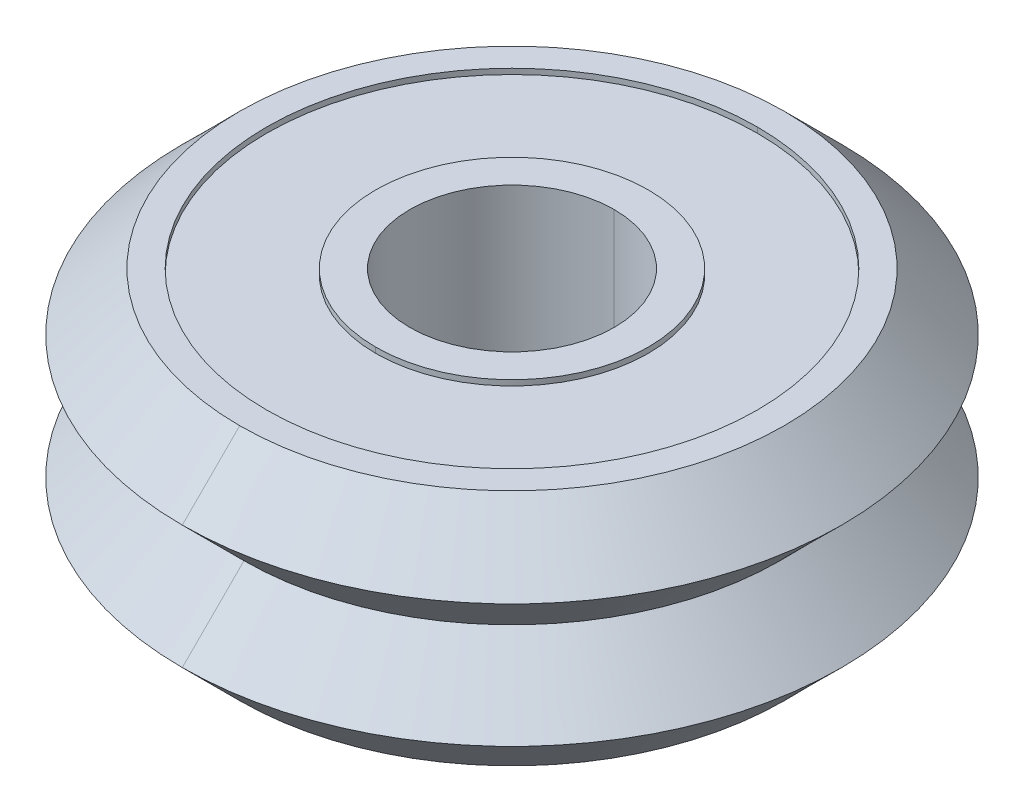
ISO-10303-21;
HEADER;
FILE_DESCRIPTION(('STEP AP214'),'2;1');
FILE_NAME('part.step','',(''),(''),'','','');
FILE_SCHEMA(('AUTOMOTIVE_DESIGN { 1 0 10303 214 1 1 1 1 }'));
ENDSEC;
DATA;
#1=APPLICATION_CONTEXT('core data for automotive mechanical design processes');
#2=APPLICATION_PROTOCOL_DEFINITION('international standard','automotive_design',2000,#1);
#3=PRODUCT_CONTEXT('',#1,'mechanical');
#4=PRODUCT('Part','Part','',(#3));
#5=PRODUCT_RELATED_PRODUCT_CATEGORY('part','',(#4));
#6=PRODUCT_DEFINITION_FORMATION('','',#4);
#7=PRODUCT_DEFINITION_CONTEXT('part definition',#1,'design');
#8=PRODUCT_DEFINITION('design','',#6,#7);
#9=PRODUCT_DEFINITION_SHAPE('','',#8);
#10=(LENGTH_UNIT() NAMED_UNIT(*) SI_UNIT(.MILLI.,.METRE.));
#11=(NAMED_UNIT(*) PLANE_ANGLE_UNIT() SI_UNIT($,.RADIAN.));
#12=(NAMED_UNIT(*) SI_UNIT($,.STERADIAN.) SOLID_ANGLE_UNIT());
#13=UNCERTAINTY_MEASURE_WITH_UNIT(LENGTH_MEASURE(1.E-05),#10,'distance_accuracy_value','');
#14=(GEOMETRIC_REPRESENTATION_CONTEXT(3) GLOBAL_UNCERTAINTY_ASSIGNED_CONTEXT((#13)) GLOBAL_UNIT_ASSIGNED_CONTEXT((#10,
#11,#12)) REPRESENTATION_CONTEXT('',''));
#15=CARTESIAN_POINT('',(0.,0.,0.));
#16=DIRECTION('',(0.,0.,1.));
#17=DIRECTION('',(1.,0.,0.));
#18=AXIS2_PLACEMENT_3D('',#15,#16,#17);
#19=CARTESIAN_POINT('',(0.,-5.296,0.));
#20=DIRECTION('',(0.,-1.,0.));
#21=DIRECTION('',(0.,0.,-1.));
#22=AXIS2_PLACEMENT_3D('',#19,#20,#21);
#23=CYLINDRICAL_SURFACE('',#22,6.35);
#24=DIRECTION('',(0.,-1.,0.));
#25=VECTOR('',#24,1.);
#26=CARTESIAN_POINT('',(0.,-5.296,6.35));
#27=LINE('',#26,#25);
#28=CARTESIAN_POINT('',(0.,-5.296,6.35));
#29=VERTEX_POINT('',#28);
#30=CARTESIAN_POINT('',(0.,-5.55,6.35));
#31=VERTEX_POINT('',#30);
#32=EDGE_CURVE('E176',#29,#31,#27,.T.);
#33=ORIENTED_EDGE('',*,*,#32,.F.);
#34=CARTESIAN_POINT('',(0.,-5.296,0.));
#35=DIRECTION('',(0.,1.,0.));
#36=DIRECTION('',(0.,0.,1.));
#37=AXIS2_PLACEMENT_3D('',#34,#35,#36);
#38=CIRCLE('',#37,6.35);
#39=CARTESIAN_POINT('',(0.,-5.296,-6.35));
#40=VERTEX_POINT('',#39);
#41=EDGE_CURVE('E11',#40,#29,#38,.T.);
#42=ORIENTED_EDGE('',*,*,#41,.F.);
#43=DIRECTION('',(0.,-1.,0.));
#44=VECTOR('',#43,1.);
#45=CARTESIAN_POINT('',(0.,-5.296,-6.35));
#46=LINE('',#45,#44);
#47=CARTESIAN_POINT('',(0.,-5.55,-6.35));
#48=VERTEX_POINT('',#47);
#49=EDGE_CURVE('E168',#40,#48,#46,.T.);
#50=ORIENTED_EDGE('',*,*,#49,.T.);
#51=CARTESIAN_POINT('',(0.,-5.55,0.));
#52=DIRECTION('',(0.,1.,0.));
#53=DIRECTION('',(0.,0.,1.));
#54=AXIS2_PLACEMENT_3D('',#51,#52,#53);
#55=CIRCLE('',#54,6.35);
#56=EDGE_CURVE('E155',#48,#31,#55,.T.);
#57=ORIENTED_EDGE('',*,*,#56,.T.);
#58=EDGE_LOOP('',(#33,#42,#50,#57));
#59=FACE_BOUND('',#58,.T.);
#60=ADVANCED_FACE('F16',(#59),#23,.T.);
#61=CARTESIAN_POINT('',(0.,-5.296,0.));
#62=DIRECTION('',(0.,-1.,0.));
#63=DIRECTION('',(0.,0.,-1.));
#64=AXIS2_PLACEMENT_3D('',#61,#62,#63);
#65=CYLINDRICAL_SURFACE('',#64,11.43);
#66=DIRECTION('',(0.,-1.,0.));
#67=VECTOR('',#66,1.);
#68=CARTESIAN_POINT('',(0.,-5.296,11.43));
#69=LINE('',#68,#67);
#70=CARTESIAN_POINT('',(0.,-5.296,11.43));
#71=VERTEX_POINT('',#70);
#72=CARTESIAN_POINT('',(0.,-5.55,11.43));
#73=VERTEX_POINT('',#72);
#74=EDGE_CURVE('E216',#71,#73,#69,.T.);
#75=ORIENTED_EDGE('',*,*,#74,.F.);
#76=CARTESIAN_POINT('',(0.,-5.296,0.));
#77=DIRECTION('',(0.,1.,0.));
#78=DIRECTION('',(0.,0.,1.));
#79=AXIS2_PLACEMENT_3D('',#76,#77,#78);
#80=CIRCLE('',#79,11.43);
#81=CARTESIAN_POINT('',(0.,-5.296,-11.43));
#82=VERTEX_POINT('',#81);
#83=EDGE_CURVE('E27',#71,#82,#80,.T.);
#84=ORIENTED_EDGE('',*,*,#83,.T.);
#85=DIRECTION('',(0.,-1.,0.));
#86=VECTOR('',#85,1.);
#87=CARTESIAN_POINT('',(0.,-5.296,-11.43));
#88=LINE('',#87,#86);
#89=CARTESIAN_POINT('',(0.,-5.55,-11.43));
#90=VERTEX_POINT('',#89);
#91=EDGE_CURVE('E224',#82,#90,#88,.T.);
#92=ORIENTED_EDGE('',*,*,#91,.T.);
#93=CARTESIAN_POINT('',(0.,-5.55,0.));
#94=DIRECTION('',(0.,1.,0.));
#95=DIRECTION('',(0.,0.,1.));
#96=AXIS2_PLACEMENT_3D('',#93,#94,#95);
#97=CIRCLE('',#96,11.43);
#98=EDGE_CURVE('E192',#73,#90,#97,.T.);
#99=ORIENTED_EDGE('',*,*,#98,.F.);
#100=EDGE_LOOP('',(#75,#84,#92,#99));
#101=FACE_BOUND('',#100,.T.);
#102=ADVANCED_FACE('F379',(#101),#65,.F.);
#103=CARTESIAN_POINT('',(0.,-5.296,0.));
#104=DIRECTION('',(0.,-1.,0.));
#105=DIRECTION('',(0.,0.,-1.));
#106=AXIS2_PLACEMENT_3D('',#103,#104,#105);
#107=PLANE('',#106);
#108=ORIENTED_EDGE('',*,*,#41,.T.);
#109=CARTESIAN_POINT('',(0.,-5.296,0.));
#110=DIRECTION('',(0.,1.,0.));
#111=DIRECTION('',(0.,0.,1.));
#112=AXIS2_PLACEMENT_3D('',#109,#110,#111);
#113=CIRCLE('',#112,6.35);
#114=EDGE_CURVE('E183',#29,#40,#113,.T.);
#115=ORIENTED_EDGE('',*,*,#114,.T.);
#116=EDGE_LOOP('',(#108,#115));
#117=FACE_BOUND('',#116,.T.);
#118=CARTESIAN_POINT('',(0.,-5.296,0.));
#119=DIRECTION('',(0.,1.,0.));
#120=DIRECTION('',(0.,0.,1.));
#121=AXIS2_PLACEMENT_3D('',#118,#119,#120);
#122=CIRCLE('',#121,11.43);
#123=EDGE_CURVE('E173',#82,#71,#122,.T.);
#124=ORIENTED_EDGE('',*,*,#123,.F.);
#125=ORIENTED_EDGE('',*,*,#83,.F.);
#126=EDGE_LOOP('',(#124,#125));
#127=FACE_BOUND('',#126,.T.);
#128=ADVANCED_FACE('F384',(#117,#127),#107,.T.);
#129=CARTESIAN_POINT('',(0.,5.296,0.));
#130=DIRECTION('',(0.,1.,0.));
#131=DIRECTION('',(0.,0.,1.));
#132=AXIS2_PLACEMENT_3D('',#129,#130,#131);
#133=CYLINDRICAL_SURFACE('',#132,6.35);
#134=DIRECTION('',(0.,1.,0.));
#135=VECTOR('',#134,1.);
#136=CARTESIAN_POINT('',(0.,5.296,-6.35));
#137=LINE('',#136,#135);
#138=CARTESIAN_POINT('',(0.,5.296,-6.35));
#139=VERTEX_POINT('',#138);
#140=CARTESIAN_POINT('',(0.,5.55,-6.35));
#141=VERTEX_POINT('',#140);
#142=EDGE_CURVE('E229',#139,#141,#137,.T.);
#143=ORIENTED_EDGE('',*,*,#142,.F.);
#144=CARTESIAN_POINT('',(0.,5.296,0.));
#145=DIRECTION('',(0.,1.,0.));
#146=DIRECTION('',(0.,0.,1.));
#147=AXIS2_PLACEMENT_3D('',#144,#145,#146);
#148=CIRCLE('',#147,6.35);
#149=CARTESIAN_POINT('',(0.,5.296,6.35));
#150=VERTEX_POINT('',#149);
#151=EDGE_CURVE('E206',#139,#150,#148,.T.);
#152=ORIENTED_EDGE('',*,*,#151,.T.);
#153=DIRECTION('',(0.,1.,0.));
#154=VECTOR('',#153,1.);
#155=CARTESIAN_POINT('',(0.,5.296,6.35));
#156=LINE('',#155,#154);
#157=CARTESIAN_POINT('',(0.,5.55,6.35));
#158=VERTEX_POINT('',#157);
#159=EDGE_CURVE('E187',#150,#158,#156,.T.);
#160=ORIENTED_EDGE('',*,*,#159,.T.);
#161=CARTESIAN_POINT('',(0.,5.55,0.));
#162=DIRECTION('',(0.,1.,0.));
#163=DIRECTION('',(0.,0.,1.));
#164=AXIS2_PLACEMENT_3D('',#161,#162,#163);
#165=CIRCLE('',#164,6.35);
#166=EDGE_CURVE('E196',#141,#158,#165,.T.);
#167=ORIENTED_EDGE('',*,*,#166,.F.);
#168=EDGE_LOOP('',(#143,#152,#160,#167));
#169=FACE_BOUND('',#168,.T.);
#170=ADVANCED_FACE('F467',(#169),#133,.T.);
#171=CARTESIAN_POINT('',(0.,5.296,0.));
#172=DIRECTION('',(0.,1.,0.));
#173=DIRECTION('',(1.,0.,0.));
#174=AXIS2_PLACEMENT_3D('',#171,#172,#173);
#175=PLANE('',#174);
#176=CARTESIAN_POINT('',(0.,5.296,0.));
#177=DIRECTION('',(0.,1.,0.));
#178=DIRECTION('',(0.,0.,1.));
#179=AXIS2_PLACEMENT_3D('',#176,#177,#178);
#180=CIRCLE('',#179,6.35);
#181=EDGE_CURVE('E225',#150,#139,#180,.T.);
#182=ORIENTED_EDGE('',*,*,#181,.F.);
#183=ORIENTED_EDGE('',*,*,#151,.F.);
#184=EDGE_LOOP('',(#182,#183));
#185=FACE_BOUND('',#184,.T.);
#186=CARTESIAN_POINT('',(0.,5.296,0.));
#187=DIRECTION('',(0.,1.,0.));
#188=DIRECTION('',(0.,0.,1.));
#189=AXIS2_PLACEMENT_3D('',#186,#187,#188);
#190=CIRCLE('',#189,11.43);
#191=CARTESIAN_POINT('',(0.,5.296,11.43));
#192=VERTEX_POINT('',#191);
#193=CARTESIAN_POINT('',(0.,5.296,-11.43));
#194=VERTEX_POINT('',#193);
#195=EDGE_CURVE('E203',#192,#194,#190,.T.);
#196=ORIENTED_EDGE('',*,*,#195,.T.);
#197=CARTESIAN_POINT('',(0.,5.296,0.));
#198=DIRECTION('',(0.,1.,0.));
#199=DIRECTION('',(0.,0.,1.));
#200=AXIS2_PLACEMENT_3D('',#197,#198,#199);
#201=CIRCLE('',#200,11.43);
#202=EDGE_CURVE('E269',#194,#192,#201,.T.);
#203=ORIENTED_EDGE('',*,*,#202,.T.);
#204=EDGE_LOOP('',(#196,#203));
#205=FACE_BOUND('',#204,.T.);
#206=ADVANCED_FACE('F18',(#185,#205),#175,.T.);
#207=CARTESIAN_POINT('',(0.,5.296,0.));
#208=DIRECTION('',(0.,1.,0.));
#209=DIRECTION('',(0.,0.,1.));
#210=AXIS2_PLACEMENT_3D('',#207,#208,#209);
#211=CYLINDRICAL_SURFACE('',#210,11.43);
#212=DIRECTION('',(0.,1.,0.));
#213=VECTOR('',#212,1.);
#214=CARTESIAN_POINT('',(0.,5.296,-11.43));
#215=LINE('',#214,#213);
#216=CARTESIAN_POINT('',(0.,5.55,-11.43));
#217=VERTEX_POINT('',#216);
#218=EDGE_CURVE('E261',#194,#217,#215,.T.);
#219=ORIENTED_EDGE('',*,*,#218,.F.);
#220=ORIENTED_EDGE('',*,*,#195,.F.);
#221=DIRECTION('',(0.,1.,0.));
#222=VECTOR('',#221,1.);
#223=CARTESIAN_POINT('',(0.,5.296,11.43));
#224=LINE('',#223,#222);
#225=CARTESIAN_POINT('',(0.,5.55,11.43));
#226=VERTEX_POINT('',#225);
#227=EDGE_CURVE('E246',#192,#226,#224,.T.);
#228=ORIENTED_EDGE('',*,*,#227,.T.);
#229=CARTESIAN_POINT('',(0.,5.55,0.));
#230=DIRECTION('',(0.,1.,0.));
#231=DIRECTION('',(0.,0.,1.));
#232=AXIS2_PLACEMENT_3D('',#229,#230,#231);
#233=CIRCLE('',#232,11.43);
#234=EDGE_CURVE('E210',#226,#217,#233,.T.);
#235=ORIENTED_EDGE('',*,*,#234,.T.);
#236=EDGE_LOOP('',(#219,#220,#228,#235));
#237=FACE_BOUND('',#236,.T.);
#238=ADVANCED_FACE('F556',(#237),#211,.F.);
#239=CARTESIAN_POINT('',(0.,2.875,0.));
#240=DIRECTION('',(0.,-1.,0.));
#241=DIRECTION('',(0.,0.,-1.));
#242=AXIS2_PLACEMENT_3D('',#239,#240,#241);
#243=CONICAL_SURFACE('',#242,15.365,0.785398163397449);
#244=DIRECTION('',(0.,-0.707106781186547,0.707106781186548));
#245=VECTOR('',#244,1.);
#246=CARTESIAN_POINT('',(0.,2.875,15.365));
#247=LINE('',#246,#245);
#248=CARTESIAN_POINT('',(0.,5.55,12.69));
#249=VERTEX_POINT('',#248);
#250=CARTESIAN_POINT('',(0.,2.875,15.365));
#251=VERTEX_POINT('',#250);
#252=EDGE_CURVE('E259',#249,#251,#247,.T.);
#253=ORIENTED_EDGE('',*,*,#252,.F.);
#254=CARTESIAN_POINT('',(0.,5.55,0.));
#255=DIRECTION('',(0.,1.,0.));
#256=DIRECTION('',(0.,0.,1.));
#257=AXIS2_PLACEMENT_3D('',#254,#255,#256);
#258=CIRCLE('',#257,12.69);
#259=CARTESIAN_POINT('',(0.,5.55,-12.69));
#260=VERTEX_POINT('',#259);
#261=EDGE_CURVE('E213',#260,#249,#258,.T.);
#262=ORIENTED_EDGE('',*,*,#261,.F.);
#263=DIRECTION('',(0.,-0.707106781186547,-0.707106781186548));
#264=VECTOR('',#263,1.);
#265=CARTESIAN_POINT('',(0.,2.875,-15.365));
#266=LINE('',#265,#264);
#267=CARTESIAN_POINT('',(0.,2.875,-15.365));
#268=VERTEX_POINT('',#267);
#269=EDGE_CURVE('E291',#260,#268,#266,.T.);
#270=ORIENTED_EDGE('',*,*,#269,.T.);
#271=CARTESIAN_POINT('',(0.,2.875,0.));
#272=DIRECTION('',(0.,1.,0.));
#273=DIRECTION('',(0.,0.,1.));
#274=AXIS2_PLACEMENT_3D('',#271,#272,#273);
#275=CIRCLE('',#274,15.365);
#276=EDGE_CURVE('E207',#268,#251,#275,.T.);
#277=ORIENTED_EDGE('',*,*,#276,.T.);
#278=EDGE_LOOP('',(#253,#262,#270,#277));
#279=FACE_BOUND('',#278,.T.);
#280=ADVANCED_FACE('F359',(#279),#243,.T.);
#281=CARTESIAN_POINT('',(0.,0.,0.));
#282=DIRECTION('',(0.,1.,0.));
#283=DIRECTION('',(0.,0.,1.));
#284=AXIS2_PLACEMENT_3D('',#281,#282,#283);
#285=CONICAL_SURFACE('',#284,12.49,0.785398163397448);
#286=DIRECTION('',(0.,0.707106781186548,-0.707106781186547));
#287=VECTOR('',#286,1.);
#288=CARTESIAN_POINT('',(0.,0.,-12.49));
#289=LINE('',#288,#287);
#290=CARTESIAN_POINT('',(0.,0.,-12.49));
#291=VERTEX_POINT('',#290);
#292=EDGE_CURVE('E290',#291,#268,#289,.T.);
#293=ORIENTED_EDGE('',*,*,#292,.F.);
#294=CARTESIAN_POINT('',(0.,0.,0.));
#295=DIRECTION('',(0.,1.,0.));
#296=DIRECTION('',(0.,0.,1.));
#297=AXIS2_PLACEMENT_3D('',#294,#295,#296);
#298=CIRCLE('',#297,12.49);
#299=CARTESIAN_POINT('',(0.,0.,12.49));
#300=VERTEX_POINT('',#299);
#301=EDGE_CURVE('E245',#291,#300,#298,.T.);
#302=ORIENTED_EDGE('',*,*,#301,.T.);
#303=DIRECTION('',(0.,0.707106781186548,0.707106781186547));
#304=VECTOR('',#303,1.);
#305=CARTESIAN_POINT('',(0.,0.,12.49));
#306=LINE('',#305,#304);
#307=EDGE_CURVE('E239',#300,#251,#306,.T.);
#308=ORIENTED_EDGE('',*,*,#307,.T.);
#309=ORIENTED_EDGE('',*,*,#276,.F.);
#310=EDGE_LOOP('',(#293,#302,#308,#309));
#311=FACE_BOUND('',#310,.T.);
#312=ADVANCED_FACE('F353',(#311),#285,.T.);
#313=CARTESIAN_POINT('',(0.,-2.875,0.));
#314=DIRECTION('',(0.,-1.,0.));
#315=DIRECTION('',(0.,0.,-1.));
#316=AXIS2_PLACEMENT_3D('',#313,#314,#315);
#317=CONICAL_SURFACE('',#316,15.365,0.785398163397448);
#318=DIRECTION('',(0.,-0.707106781186548,0.707106781186547));
#319=VECTOR('',#318,1.);
#320=CARTESIAN_POINT('',(0.,-2.875,15.365));
#321=LINE('',#320,#319);
#322=CARTESIAN_POINT('',(0.,-2.875,15.365));
#323=VERTEX_POINT('',#322);
#324=EDGE_CURVE('E235',#300,#323,#321,.T.);
#325=ORIENTED_EDGE('',*,*,#324,.F.);
#326=ORIENTED_EDGE('',*,*,#301,.F.);
#327=DIRECTION('',(0.,-0.707106781186548,-0.707106781186547));
#328=VECTOR('',#327,1.);
#329=CARTESIAN_POINT('',(0.,-2.875,-15.365));
#330=LINE('',#329,#328);
#331=CARTESIAN_POINT('',(0.,-2.875,-15.365));
#332=VERTEX_POINT('',#331);
#333=EDGE_CURVE('E202',#291,#332,#330,.T.);
#334=ORIENTED_EDGE('',*,*,#333,.T.);
#335=CARTESIAN_POINT('',(0.,-2.875,0.));
#336=DIRECTION('',(0.,1.,0.));
#337=DIRECTION('',(0.,0.,1.));
#338=AXIS2_PLACEMENT_3D('',#335,#336,#337);
#339=CIRCLE('',#338,15.365);
#340=EDGE_CURVE('E164',#332,#323,#339,.T.);
#341=ORIENTED_EDGE('',*,*,#340,.T.);
#342=EDGE_LOOP('',(#325,#326,#334,#341));
#343=FACE_BOUND('',#342,.T.);
#344=ADVANCED_FACE('F398',(#343),#317,.T.);
#345=CARTESIAN_POINT('',(0.,-5.55,0.));
#346=DIRECTION('',(0.,1.,0.));
#347=DIRECTION('',(0.,0.,1.));
#348=AXIS2_PLACEMENT_3D('',#345,#346,#347);
#349=CONICAL_SURFACE('',#348,12.69,0.785398163397449);
#350=DIRECTION('',(0.,0.707106781186547,-0.707106781186548));
#351=VECTOR('',#350,1.);
#352=CARTESIAN_POINT('',(0.,-5.55,-12.69));
#353=LINE('',#352,#351);
#354=CARTESIAN_POINT('',(0.,-5.55,-12.69));
#355=VERTEX_POINT('',#354);
#356=EDGE_CURVE('E201',#355,#332,#353,.T.);
#357=ORIENTED_EDGE('',*,*,#356,.F.);
#358=CARTESIAN_POINT('',(0.,-5.55,0.));
#359=DIRECTION('',(0.,1.,0.));
#360=DIRECTION('',(0.,0.,1.));
#361=AXIS2_PLACEMENT_3D('',#358,#359,#360);
#362=CIRCLE('',#361,12.69);
#363=CARTESIAN_POINT('',(0.,-5.55,12.69));
#364=VERTEX_POINT('',#363);
#365=EDGE_CURVE('E189',#355,#364,#362,.T.);
#366=ORIENTED_EDGE('',*,*,#365,.T.);
#367=DIRECTION('',(0.,0.707106781186547,0.707106781186548));
#368=VECTOR('',#367,1.);
#369=CARTESIAN_POINT('',(0.,-5.55,12.69));
#370=LINE('',#369,#368);
#371=EDGE_CURVE('E230',#364,#323,#370,.T.);
#372=ORIENTED_EDGE('',*,*,#371,.T.);
#373=ORIENTED_EDGE('',*,*,#340,.F.);
#374=EDGE_LOOP('',(#357,#366,#372,#373));
#375=FACE_BOUND('',#374,.T.);
#376=ADVANCED_FACE('F396',(#375),#349,.T.);
#377=CARTESIAN_POINT('',(12.69,-5.55,0.));
#378=DIRECTION('',(0.,1.,0.));
#379=DIRECTION('',(1.,0.,0.));
#380=AXIS2_PLACEMENT_3D('',#377,#378,#379);
#381=PLANE('',#380);
#382=CARTESIAN_POINT('',(0.,-5.55,0.));
#383=DIRECTION('',(0.,1.,0.));
#384=DIRECTION('',(0.,0.,1.));
#385=AXIS2_PLACEMENT_3D('',#382,#383,#384);
#386=CIRCLE('',#385,4.7625);
#387=CARTESIAN_POINT('',(0.,-5.55,4.7625));
#388=VERTEX_POINT('',#387);
#389=CARTESIAN_POINT('',(0.,-5.55,-4.7625));
#390=VERTEX_POINT('',#389);
#391=EDGE_CURVE('E165',#388,#390,#386,.T.);
#392=ORIENTED_EDGE('',*,*,#391,.T.);
#393=CARTESIAN_POINT('',(0.,-5.55,0.));
#394=DIRECTION('',(0.,1.,0.));
#395=DIRECTION('',(0.,0.,1.));
#396=AXIS2_PLACEMENT_3D('',#393,#394,#395);
#397=CIRCLE('',#396,4.7625);
#398=EDGE_CURVE('E234',#390,#388,#397,.T.);
#399=ORIENTED_EDGE('',*,*,#398,.T.);
#400=EDGE_LOOP('',(#392,#399));
#401=FACE_BOUND('',#400,.T.);
#402=ORIENTED_EDGE('',*,*,#56,.F.);
#403=CARTESIAN_POINT('',(0.,-5.55,0.));
#404=DIRECTION('',(0.,1.,0.));
#405=DIRECTION('',(0.,0.,1.));
#406=AXIS2_PLACEMENT_3D('',#403,#404,#405);
#407=CIRCLE('',#406,6.35);
#408=EDGE_CURVE('E159',#31,#48,#407,.T.);
#409=ORIENTED_EDGE('',*,*,#408,.F.);
#410=EDGE_LOOP('',(#402,#409));
#411=FACE_BOUND('',#410,.T.);
#412=ADVANCED_FACE('F157',(#401,#411),#381,.F.);
#413=CARTESIAN_POINT('',(0.,64.3897959183673,0.));
#414=DIRECTION('',(0.,1.,0.));
#415=DIRECTION('',(0.,0.,1.));
#416=AXIS2_PLACEMENT_3D('',#413,#414,#415);
#417=CYLINDRICAL_SURFACE('',#416,4.7625);
#418=DIRECTION('',(0.,1.,0.));
#419=VECTOR('',#418,1.);
#420=CARTESIAN_POINT('',(0.,64.3897959183673,-4.7625));
#421=LINE('',#420,#419);
#422=CARTESIAN_POINT('',(0.,5.55,-4.7625));
#423=VERTEX_POINT('',#422);
#424=EDGE_CURVE('E278',#390,#423,#421,.T.);
#425=ORIENTED_EDGE('',*,*,#424,.F.);
#426=ORIENTED_EDGE('',*,*,#391,.F.);
#427=DIRECTION('',(0.,1.,0.));
#428=VECTOR('',#427,1.);
#429=CARTESIAN_POINT('',(0.,64.3897959183673,4.7625));
#430=LINE('',#429,#428);
#431=CARTESIAN_POINT('',(0.,5.55,4.7625));
#432=VERTEX_POINT('',#431);
#433=EDGE_CURVE('E193',#388,#432,#430,.T.);
#434=ORIENTED_EDGE('',*,*,#433,.T.);
#435=CARTESIAN_POINT('',(0.,5.55,0.));
#436=DIRECTION('',(0.,1.,0.));
#437=DIRECTION('',(0.,0.,1.));
#438=AXIS2_PLACEMENT_3D('',#435,#436,#437);
#439=CIRCLE('',#438,4.7625);
#440=EDGE_CURVE('E40',#432,#423,#439,.T.);
#441=ORIENTED_EDGE('',*,*,#440,.T.);
#442=EDGE_LOOP('',(#425,#426,#434,#441));
#443=FACE_BOUND('',#442,.T.);
#444=ADVANCED_FACE('F365',(#443),#417,.F.);
#445=CARTESIAN_POINT('',(4.7625,5.55,0.));
#446=DIRECTION('',(0.,-1.,0.));
#447=DIRECTION('',(0.,0.,-1.));
#448=AXIS2_PLACEMENT_3D('',#445,#446,#447);
#449=PLANE('',#448);
#450=ORIENTED_EDGE('',*,*,#234,.F.);
#451=CARTESIAN_POINT('',(0.,5.55,0.));
#452=DIRECTION('',(0.,1.,0.));
#453=DIRECTION('',(0.,0.,1.));
#454=AXIS2_PLACEMENT_3D('',#451,#452,#453);
#455=CIRCLE('',#454,11.43);
#456=EDGE_CURVE('E250',#217,#226,#455,.T.);
#457=ORIENTED_EDGE('',*,*,#456,.F.);
#458=EDGE_LOOP('',(#450,#457));
#459=FACE_BOUND('',#458,.T.);
#460=ORIENTED_EDGE('',*,*,#261,.T.);
#461=CARTESIAN_POINT('',(0.,5.55,0.));
#462=DIRECTION('',(0.,1.,0.));
#463=DIRECTION('',(0.,0.,1.));
#464=AXIS2_PLACEMENT_3D('',#461,#462,#463);
#465=CIRCLE('',#464,12.69);
#466=EDGE_CURVE('E249',#249,#260,#465,.T.);
#467=ORIENTED_EDGE('',*,*,#466,.T.);
#468=EDGE_LOOP('',(#460,#467));
#469=FACE_BOUND('',#468,.T.);
#470=ADVANCED_FACE('F362',(#459,#469),#449,.F.);
#471=CARTESIAN_POINT('',(4.7625,5.55,0.));
#472=DIRECTION('',(0.,-1.,0.));
#473=DIRECTION('',(0.,0.,-1.));
#474=AXIS2_PLACEMENT_3D('',#471,#472,#473);
#475=PLANE('',#474);
#476=ORIENTED_EDGE('',*,*,#440,.F.);
#477=CARTESIAN_POINT('',(0.,5.55,0.));
#478=DIRECTION('',(0.,1.,0.));
#479=DIRECTION('',(0.,0.,1.));
#480=AXIS2_PLACEMENT_3D('',#477,#478,#479);
#481=CIRCLE('',#480,4.7625);
#482=EDGE_CURVE('E282',#423,#432,#481,.T.);
#483=ORIENTED_EDGE('',*,*,#482,.F.);
#484=EDGE_LOOP('',(#476,#483));
#485=FACE_BOUND('',#484,.T.);
#486=CARTESIAN_POINT('',(0.,5.55,0.));
#487=DIRECTION('',(0.,1.,0.));
#488=DIRECTION('',(0.,0.,1.));
#489=AXIS2_PLACEMENT_3D('',#486,#487,#488);
#490=CIRCLE('',#489,6.35);
#491=EDGE_CURVE('E313',#158,#141,#490,.T.);
#492=ORIENTED_EDGE('',*,*,#491,.T.);
#493=ORIENTED_EDGE('',*,*,#166,.T.);
#494=EDGE_LOOP('',(#492,#493));
#495=FACE_BOUND('',#494,.T.);
#496=ADVANCED_FACE('F364',(#485,#495),#475,.F.);
#497=CARTESIAN_POINT('',(12.69,-5.55,0.));
#498=DIRECTION('',(0.,1.,0.));
#499=DIRECTION('',(1.,0.,0.));
#500=AXIS2_PLACEMENT_3D('',#497,#498,#499);
#501=PLANE('',#500);
#502=CARTESIAN_POINT('',(0.,-5.55,0.));
#503=DIRECTION('',(0.,1.,0.));
#504=DIRECTION('',(0.,0.,1.));
#505=AXIS2_PLACEMENT_3D('',#502,#503,#504);
#506=CIRCLE('',#505,11.43);
#507=EDGE_CURVE('E220',#90,#73,#506,.T.);
#508=ORIENTED_EDGE('',*,*,#507,.T.);
#509=ORIENTED_EDGE('',*,*,#98,.T.);
#510=EDGE_LOOP('',(#508,#509));
#511=FACE_BOUND('',#510,.T.);
#512=CARTESIAN_POINT('',(0.,-5.55,0.));
#513=DIRECTION('',(0.,1.,0.));
#514=DIRECTION('',(0.,0.,1.));
#515=AXIS2_PLACEMENT_3D('',#512,#513,#514);
#516=CIRCLE('',#515,12.69);
#517=EDGE_CURVE('E197',#364,#355,#516,.T.);
#518=ORIENTED_EDGE('',*,*,#517,.F.);
#519=ORIENTED_EDGE('',*,*,#365,.F.);
#520=EDGE_LOOP('',(#518,#519));
#521=FACE_BOUND('',#520,.T.);
#522=ADVANCED_FACE('F373',(#511,#521),#501,.F.);
#523=CARTESIAN_POINT('',(0.,64.3897959183673,0.));
#524=DIRECTION('',(0.,1.,0.));
#525=DIRECTION('',(0.,0.,1.));
#526=AXIS2_PLACEMENT_3D('',#523,#524,#525);
#527=CYLINDRICAL_SURFACE('',#526,4.7625);
#528=ORIENTED_EDGE('',*,*,#398,.F.);
#529=ORIENTED_EDGE('',*,*,#424,.T.);
#530=ORIENTED_EDGE('',*,*,#482,.T.);
#531=ORIENTED_EDGE('',*,*,#433,.F.);
#532=EDGE_LOOP('',(#528,#529,#530,#531));
#533=FACE_BOUND('',#532,.T.);
#534=ADVANCED_FACE('F394',(#533),#527,.F.);
#535=CARTESIAN_POINT('',(0.,-5.55,0.));
#536=DIRECTION('',(0.,1.,0.));
#537=DIRECTION('',(0.,0.,1.));
#538=AXIS2_PLACEMENT_3D('',#535,#536,#537);
#539=CONICAL_SURFACE('',#538,12.69,0.785398163397449);
#540=ORIENTED_EDGE('',*,*,#517,.T.);
#541=ORIENTED_EDGE('',*,*,#356,.T.);
#542=CARTESIAN_POINT('',(0.,-2.875,0.));
#543=DIRECTION('',(0.,1.,0.));
#544=DIRECTION('',(0.,0.,1.));
#545=AXIS2_PLACEMENT_3D('',#542,#543,#544);
#546=CIRCLE('',#545,15.365);
#547=EDGE_CURVE('E20',#323,#332,#546,.T.);
#548=ORIENTED_EDGE('',*,*,#547,.F.);
#549=ORIENTED_EDGE('',*,*,#371,.F.);
#550=EDGE_LOOP('',(#540,#541,#548,#549));
#551=FACE_BOUND('',#550,.T.);
#552=ADVANCED_FACE('F390',(#551),#539,.T.);
#553=CARTESIAN_POINT('',(0.,-2.875,0.));
#554=DIRECTION('',(0.,-1.,0.));
#555=DIRECTION('',(0.,0.,-1.));
#556=AXIS2_PLACEMENT_3D('',#553,#554,#555);
#557=CONICAL_SURFACE('',#556,15.365,0.785398163397448);
#558=CARTESIAN_POINT('',(0.,0.,0.));
#559=DIRECTION('',(0.,1.,0.));
#560=DIRECTION('',(0.,0.,1.));
#561=AXIS2_PLACEMENT_3D('',#558,#559,#560);
#562=CIRCLE('',#561,12.49);
#563=EDGE_CURVE('E286',#300,#291,#562,.T.);
#564=ORIENTED_EDGE('',*,*,#563,.F.);
#565=ORIENTED_EDGE('',*,*,#324,.T.);
#566=ORIENTED_EDGE('',*,*,#547,.T.);
#567=ORIENTED_EDGE('',*,*,#333,.F.);
#568=EDGE_LOOP('',(#564,#565,#566,#567));
#569=FACE_BOUND('',#568,.T.);
#570=ADVANCED_FACE('F393',(#569),#557,.T.);
#571=CARTESIAN_POINT('',(0.,0.,0.));
#572=DIRECTION('',(0.,1.,0.));
#573=DIRECTION('',(0.,0.,1.));
#574=AXIS2_PLACEMENT_3D('',#571,#572,#573);
#575=CONICAL_SURFACE('',#574,12.49,0.785398163397448);
#576=ORIENTED_EDGE('',*,*,#563,.T.);
#577=ORIENTED_EDGE('',*,*,#292,.T.);
#578=CARTESIAN_POINT('',(0.,2.875,0.));
#579=DIRECTION('',(0.,1.,0.));
#580=DIRECTION('',(0.,0.,1.));
#581=AXIS2_PLACEMENT_3D('',#578,#579,#580);
#582=CIRCLE('',#581,15.365);
#583=EDGE_CURVE('E318',#251,#268,#582,.T.);
#584=ORIENTED_EDGE('',*,*,#583,.F.);
#585=ORIENTED_EDGE('',*,*,#307,.F.);
#586=EDGE_LOOP('',(#576,#577,#584,#585));
#587=FACE_BOUND('',#586,.T.);
#588=ADVANCED_FACE('F357',(#587),#575,.T.);
#589=CARTESIAN_POINT('',(0.,2.875,0.));
#590=DIRECTION('',(0.,-1.,0.));
#591=DIRECTION('',(0.,0.,-1.));
#592=AXIS2_PLACEMENT_3D('',#589,#590,#591);
#593=CONICAL_SURFACE('',#592,15.365,0.785398163397449);
#594=ORIENTED_EDGE('',*,*,#466,.F.);
#595=ORIENTED_EDGE('',*,*,#252,.T.);
#596=ORIENTED_EDGE('',*,*,#583,.T.);
#597=ORIENTED_EDGE('',*,*,#269,.F.);
#598=EDGE_LOOP('',(#594,#595,#596,#597));
#599=FACE_BOUND('',#598,.T.);
#600=ADVANCED_FACE('F360',(#599),#593,.T.);
#601=CARTESIAN_POINT('',(0.,5.296,0.));
#602=DIRECTION('',(0.,1.,0.));
#603=DIRECTION('',(0.,0.,1.));
#604=AXIS2_PLACEMENT_3D('',#601,#602,#603);
#605=CYLINDRICAL_SURFACE('',#604,11.43);
#606=ORIENTED_EDGE('',*,*,#202,.F.);
#607=ORIENTED_EDGE('',*,*,#218,.T.);
#608=ORIENTED_EDGE('',*,*,#456,.T.);
#609=ORIENTED_EDGE('',*,*,#227,.F.);
#610=EDGE_LOOP('',(#606,#607,#608,#609));
#611=FACE_BOUND('',#610,.T.);
#612=ADVANCED_FACE('F490',(#611),#605,.F.);
#613=CARTESIAN_POINT('',(0.,5.296,0.));
#614=DIRECTION('',(0.,1.,0.));
#615=DIRECTION('',(0.,0.,1.));
#616=AXIS2_PLACEMENT_3D('',#613,#614,#615);
#617=CYLINDRICAL_SURFACE('',#616,6.35);
#618=ORIENTED_EDGE('',*,*,#181,.T.);
#619=ORIENTED_EDGE('',*,*,#142,.T.);
#620=ORIENTED_EDGE('',*,*,#491,.F.);
#621=ORIENTED_EDGE('',*,*,#159,.F.);
#622=EDGE_LOOP('',(#618,#619,#620,#621));
#623=FACE_BOUND('',#622,.T.);
#624=ADVANCED_FACE('F485',(#623),#617,.T.);
#625=CARTESIAN_POINT('',(0.,-5.296,0.));
#626=DIRECTION('',(0.,-1.,0.));
#627=DIRECTION('',(0.,0.,-1.));
#628=AXIS2_PLACEMENT_3D('',#625,#626,#627);
#629=CYLINDRICAL_SURFACE('',#628,11.43);
#630=ORIENTED_EDGE('',*,*,#123,.T.);
#631=ORIENTED_EDGE('',*,*,#74,.T.);
#632=ORIENTED_EDGE('',*,*,#507,.F.);
#633=ORIENTED_EDGE('',*,*,#91,.F.);
#634=EDGE_LOOP('',(#630,#631,#632,#633));
#635=FACE_BOUND('',#634,.T.);
#636=ADVANCED_FACE('F489',(#635),#629,.F.);
#637=CARTESIAN_POINT('',(0.,-5.296,0.));
#638=DIRECTION('',(0.,-1.,0.));
#639=DIRECTION('',(0.,0.,-1.));
#640=AXIS2_PLACEMENT_3D('',#637,#638,#639);
#641=CYLINDRICAL_SURFACE('',#640,6.35);
#642=ORIENTED_EDGE('',*,*,#114,.F.);
#643=ORIENTED_EDGE('',*,*,#32,.T.);
#644=ORIENTED_EDGE('',*,*,#408,.T.);
#645=ORIENTED_EDGE('',*,*,#49,.F.);
#646=EDGE_LOOP('',(#642,#643,#644,#645));
#647=FACE_BOUND('',#646,.T.);
#648=ADVANCED_FACE('F175',(#647),#641,.T.);
#649=CLOSED_SHELL('',(#60,#102,#128,#170,#206,#238,#280,#312,#344,#376,#412,#444,#470,#496,#522,
#534,#552,#570,#588,#600,#612,#624,#636,#648));
#650=MANIFOLD_SOLID_BREP('B1',#649);
#651=ADVANCED_BREP_SHAPE_REPRESENTATION('',(#18,#650),#14);
#652=SHAPE_DEFINITION_REPRESENTATION(#9,#651);
ENDSEC;
END-ISO-10303-21;
